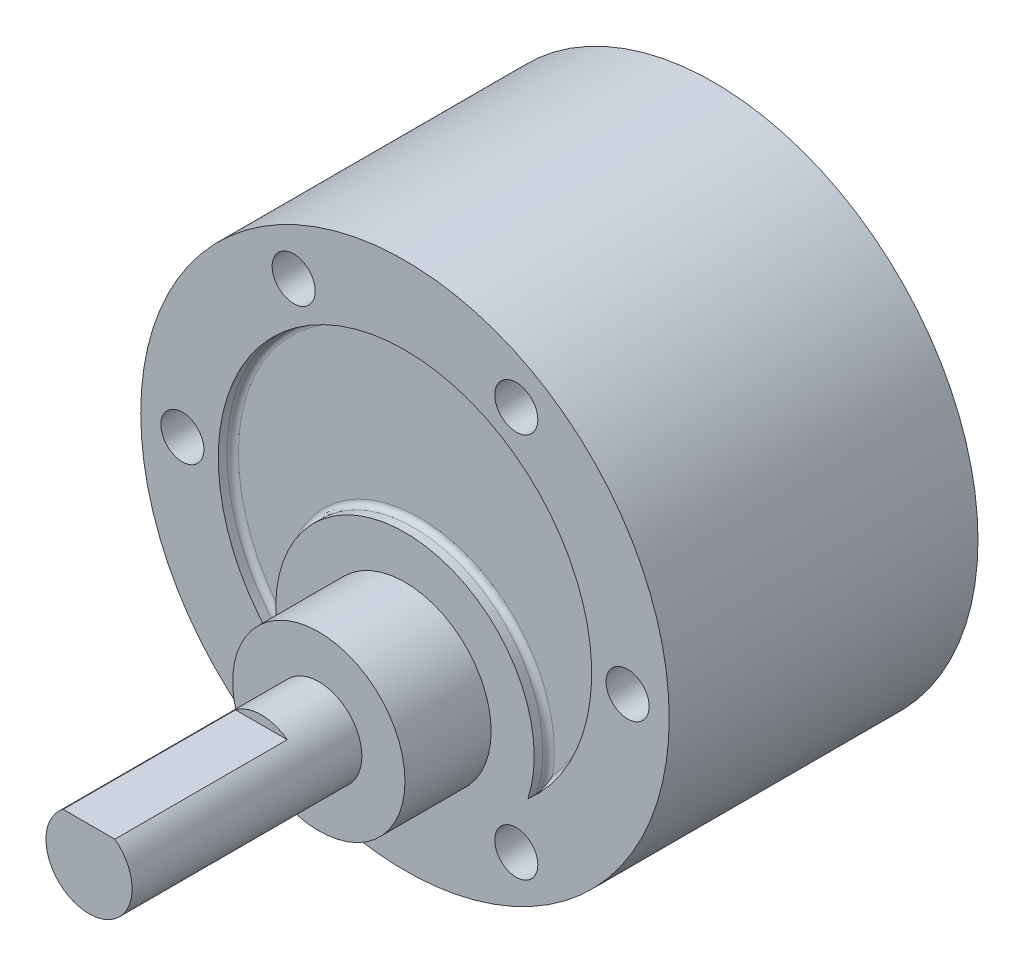
ISO-10303-21;
HEADER;
FILE_DESCRIPTION(('STEP AP214'),'2;1');
FILE_NAME('part.step','',(''),(''),'','','');
FILE_SCHEMA(('AUTOMOTIVE_DESIGN { 1 0 10303 214 1 1 1 1 }'));
ENDSEC;
DATA;
#1=APPLICATION_CONTEXT('core data for automotive mechanical design processes');
#2=APPLICATION_PROTOCOL_DEFINITION('international standard','automotive_design',2000,#1);
#3=PRODUCT_CONTEXT('',#1,'mechanical');
#4=PRODUCT('Part','Part','',(#3));
#5=PRODUCT_RELATED_PRODUCT_CATEGORY('part','',(#4));
#6=PRODUCT_DEFINITION_FORMATION('','',#4);
#7=PRODUCT_DEFINITION_CONTEXT('part definition',#1,'design');
#8=PRODUCT_DEFINITION('design','',#6,#7);
#9=PRODUCT_DEFINITION_SHAPE('','',#8);
#10=(LENGTH_UNIT() NAMED_UNIT(*) SI_UNIT(.MILLI.,.METRE.));
#11=(NAMED_UNIT(*) PLANE_ANGLE_UNIT() SI_UNIT($,.RADIAN.));
#12=(NAMED_UNIT(*) SI_UNIT($,.STERADIAN.) SOLID_ANGLE_UNIT());
#13=UNCERTAINTY_MEASURE_WITH_UNIT(LENGTH_MEASURE(1.E-05),#10,'distance_accuracy_value','');
#14=(GEOMETRIC_REPRESENTATION_CONTEXT(3) GLOBAL_UNCERTAINTY_ASSIGNED_CONTEXT((#13)) GLOBAL_UNIT_ASSIGNED_CONTEXT((#10,
#11,#12)) REPRESENTATION_CONTEXT('',''));
#15=CARTESIAN_POINT('',(0.,0.,0.));
#16=DIRECTION('',(0.,0.,1.));
#17=DIRECTION('',(1.,0.,0.));
#18=AXIS2_PLACEMENT_3D('',#15,#16,#17);
#19=CARTESIAN_POINT('',(0.,-7.,27.5));
#20=DIRECTION('',(0.,0.,1.));
#21=DIRECTION('',(1.,0.,0.));
#22=AXIS2_PLACEMENT_3D('',#19,#20,#21);
#23=PLANE('',#22);
#24=CARTESIAN_POINT('',(0.,-7.,27.5));
#25=DIRECTION('',(0.,0.,1.));
#26=DIRECTION('',(1.,0.,0.));
#27=AXIS2_PLACEMENT_3D('',#24,#25,#26);
#28=CIRCLE('',#27,6.);
#29=CARTESIAN_POINT('',(6.,-7.,27.5));
#30=VERTEX_POINT('',#29);
#31=EDGE_CURVE('E129',#30,#30,#28,.T.);
#32=ORIENTED_EDGE('',*,*,#31,.T.);
#33=EDGE_LOOP('',(#32));
#34=FACE_BOUND('',#33,.T.);
#35=CARTESIAN_POINT('',(0.,-7.,27.5));
#36=DIRECTION('',(0.,0.,1.));
#37=DIRECTION('',(1.,0.,0.));
#38=AXIS2_PLACEMENT_3D('',#35,#36,#37);
#39=CIRCLE('',#38,3.);
#40=CARTESIAN_POINT('',(3.,-7.,27.5));
#41=VERTEX_POINT('',#40);
#42=EDGE_CURVE('E114',#41,#41,#39,.T.);
#43=ORIENTED_EDGE('',*,*,#42,.F.);
#44=EDGE_LOOP('',(#43));
#45=FACE_BOUND('',#44,.T.);
#46=ADVANCED_FACE('F36',(#34,#45),#23,.T.);
#47=CARTESIAN_POINT('',(0.,0.,21.5));
#48=DIRECTION('',(0.,0.,-1.));
#49=DIRECTION('',(-1.,0.,0.));
#50=AXIS2_PLACEMENT_3D('',#47,#48,#49);
#51=CYLINDRICAL_SURFACE('',#50,18.4);
#52=CARTESIAN_POINT('',(0.,0.,21.5));
#53=DIRECTION('',(0.,0.,1.));
#54=DIRECTION('',(1.,0.,0.));
#55=AXIS2_PLACEMENT_3D('',#52,#53,#54);
#56=CIRCLE('',#55,18.4);
#57=CARTESIAN_POINT('',(18.4,0.,21.5));
#58=VERTEX_POINT('',#57);
#59=EDGE_CURVE('E135',#58,#58,#56,.T.);
#60=ORIENTED_EDGE('',*,*,#59,.F.);
#61=EDGE_LOOP('',(#60));
#62=FACE_BOUND('',#61,.T.);
#63=CARTESIAN_POINT('',(0.,0.,0.));
#64=DIRECTION('',(0.,0.,1.));
#65=DIRECTION('',(1.,0.,0.));
#66=AXIS2_PLACEMENT_3D('',#63,#64,#65);
#67=CIRCLE('',#66,18.4);
#68=CARTESIAN_POINT('',(18.4,0.,0.));
#69=VERTEX_POINT('',#68);
#70=EDGE_CURVE('E132',#69,#69,#67,.T.);
#71=ORIENTED_EDGE('',*,*,#70,.T.);
#72=EDGE_LOOP('',(#71));
#73=FACE_BOUND('',#72,.T.);
#74=ADVANCED_FACE('F156',(#62,#73),#51,.T.);
#75=CARTESIAN_POINT('',(0.,0.,21.5));
#76=DIRECTION('',(0.,0.,1.));
#77=DIRECTION('',(1.,0.,0.));
#78=AXIS2_PLACEMENT_3D('',#75,#76,#77);
#79=PLANE('',#78);
#80=CARTESIAN_POINT('',(-15.4999946,0.,21.5));
#81=DIRECTION('',(0.,0.,1.));
#82=DIRECTION('',(1.,0.,0.));
#83=AXIS2_PLACEMENT_3D('',#80,#81,#82);
#84=CIRCLE('',#83,1.5);
#85=CARTESIAN_POINT('',(-13.9999946,0.,21.5));
#86=VERTEX_POINT('',#85);
#87=EDGE_CURVE('E249',#86,#86,#84,.T.);
#88=ORIENTED_EDGE('',*,*,#87,.F.);
#89=EDGE_LOOP('',(#88));
#90=FACE_BOUND('',#89,.T.);
#91=CARTESIAN_POINT('',(-7.74999730000016,-13.4233890821215,21.5));
#92=DIRECTION('',(0.,0.,1.));
#93=DIRECTION('',(1.,0.,0.));
#94=AXIS2_PLACEMENT_3D('',#91,#92,#93);
#95=CIRCLE('',#94,1.5);
#96=CARTESIAN_POINT('',(-6.24999730000016,-13.4233890821215,21.5));
#97=VERTEX_POINT('',#96);
#98=EDGE_CURVE('E258',#97,#97,#95,.T.);
#99=ORIENTED_EDGE('',*,*,#98,.F.);
#100=EDGE_LOOP('',(#99));
#101=FACE_BOUND('',#100,.T.);
#102=CARTESIAN_POINT('',(7.7499973000002,-13.4233890821213,21.5));
#103=DIRECTION('',(0.,0.,1.));
#104=DIRECTION('',(1.,0.,0.));
#105=AXIS2_PLACEMENT_3D('',#102,#103,#104);
#106=CIRCLE('',#105,1.49999999999997);
#107=CARTESIAN_POINT('',(9.24999730000016,-13.4233890821213,21.5));
#108=VERTEX_POINT('',#107);
#109=EDGE_CURVE('E107',#108,#108,#106,.T.);
#110=ORIENTED_EDGE('',*,*,#109,.F.);
#111=EDGE_LOOP('',(#110));
#112=FACE_BOUND('',#111,.T.);
#113=CARTESIAN_POINT('',(15.4999946,4.38993287727106E-13,21.5));
#114=DIRECTION('',(0.,0.,1.));
#115=DIRECTION('',(1.,0.,0.));
#116=AXIS2_PLACEMENT_3D('',#113,#114,#115);
#117=CIRCLE('',#116,1.50000000000016);
#118=CARTESIAN_POINT('',(16.9999946000002,4.38993287727106E-13,21.5));
#119=VERTEX_POINT('',#118);
#120=EDGE_CURVE('E275',#119,#119,#117,.T.);
#121=ORIENTED_EDGE('',*,*,#120,.F.);
#122=EDGE_LOOP('',(#121));
#123=FACE_BOUND('',#122,.T.);
#124=CARTESIAN_POINT('',(7.74999729999981,13.4233890821219,21.5));
#125=DIRECTION('',(0.,0.,1.));
#126=DIRECTION('',(1.,0.,0.));
#127=AXIS2_PLACEMENT_3D('',#124,#125,#126);
#128=CIRCLE('',#127,1.5000000000003);
#129=CARTESIAN_POINT('',(9.24999730000011,13.4233890821219,21.5));
#130=VERTEX_POINT('',#129);
#131=EDGE_CURVE('E269',#130,#130,#128,.T.);
#132=ORIENTED_EDGE('',*,*,#131,.F.);
#133=EDGE_LOOP('',(#132));
#134=FACE_BOUND('',#133,.T.);
#135=CARTESIAN_POINT('',(-7.74999729999997,13.4233890821216,21.5));
#136=DIRECTION('',(0.,0.,1.));
#137=DIRECTION('',(1.,0.,0.));
#138=AXIS2_PLACEMENT_3D('',#135,#136,#137);
#139=CIRCLE('',#138,1.5);
#140=CARTESIAN_POINT('',(-6.24999729999997,13.4233890821216,21.5));
#141=VERTEX_POINT('',#140);
#142=EDGE_CURVE('E263',#141,#141,#139,.T.);
#143=ORIENTED_EDGE('',*,*,#142,.F.);
#144=EDGE_LOOP('',(#143));
#145=FACE_BOUND('',#144,.T.);
#146=CARTESIAN_POINT('',(0.,-7.,21.5));
#147=DIRECTION('',(0.,0.,-1.));
#148=DIRECTION('',(1.,0.,0.));
#149=AXIS2_PLACEMENT_3D('',#146,#147,#148);
#150=CIRCLE('',#149,9.);
#151=CARTESIAN_POINT('',(-8.55802523473537,-9.78571428571429,21.5));
#152=VERTEX_POINT('',#151);
#153=CARTESIAN_POINT('',(8.55802523473537,-9.78571428571429,21.5));
#154=VERTEX_POINT('',#153);
#155=EDGE_CURVE('E91',#152,#154,#150,.T.);
#156=ORIENTED_EDGE('',*,*,#155,.F.);
#157=CARTESIAN_POINT('',(0.,0.,21.5));
#158=DIRECTION('',(0.,0.,1.));
#159=DIRECTION('',(1.,0.,0.));
#160=AXIS2_PLACEMENT_3D('',#157,#158,#159);
#161=CIRCLE('',#160,13.);
#162=EDGE_CURVE('E98',#154,#152,#161,.T.);
#163=ORIENTED_EDGE('',*,*,#162,.F.);
#164=EDGE_LOOP('',(#156,#163));
#165=FACE_BOUND('',#164,.T.);
#166=CARTESIAN_POINT('',(0.,-7.,21.5));
#167=DIRECTION('',(0.,0.,1.));
#168=DIRECTION('',(1.,0.,0.));
#169=AXIS2_PLACEMENT_3D('',#166,#167,#168);
#170=CIRCLE('',#169,6.);
#171=CARTESIAN_POINT('',(6.,-7.,21.5));
#172=VERTEX_POINT('',#171);
#173=EDGE_CURVE('E128',#172,#172,#170,.T.);
#174=ORIENTED_EDGE('',*,*,#173,.F.);
#175=EDGE_LOOP('',(#174));
#176=FACE_BOUND('',#175,.T.);
#177=ORIENTED_EDGE('',*,*,#59,.T.);
#178=EDGE_LOOP('',(#177));
#179=FACE_BOUND('',#178,.T.);
#180=ADVANCED_FACE('F102',(#90,#101,#112,#123,#134,#145,#165,#176,#179),#79,.T.);
#181=CARTESIAN_POINT('',(0.,0.,0.));
#182=DIRECTION('',(0.,0.,1.));
#183=DIRECTION('',(1.,0.,0.));
#184=AXIS2_PLACEMENT_3D('',#181,#182,#183);
#185=PLANE('',#184);
#186=ORIENTED_EDGE('',*,*,#70,.F.);
#187=EDGE_LOOP('',(#186));
#188=FACE_BOUND('',#187,.T.);
#189=ADVANCED_FACE('F161',(#188),#185,.F.);
#190=CARTESIAN_POINT('',(0.,-7.,27.5));
#191=DIRECTION('',(0.,0.,-1.));
#192=DIRECTION('',(-1.,0.,0.));
#193=AXIS2_PLACEMENT_3D('',#190,#191,#192);
#194=CYLINDRICAL_SURFACE('',#193,6.);
#195=ORIENTED_EDGE('',*,*,#31,.F.);
#196=EDGE_LOOP('',(#195));
#197=FACE_BOUND('',#196,.T.);
#198=ORIENTED_EDGE('',*,*,#173,.T.);
#199=EDGE_LOOP('',(#198));
#200=FACE_BOUND('',#199,.T.);
#201=ADVANCED_FACE('F164',(#197,#200),#194,.T.);
#202=CARTESIAN_POINT('',(0.,-7.,43.5));
#203=DIRECTION('',(0.,0.,-1.));
#204=DIRECTION('',(-1.,0.,0.));
#205=AXIS2_PLACEMENT_3D('',#202,#203,#204);
#206=CYLINDRICAL_SURFACE('',#205,3.);
#207=ORIENTED_EDGE('',*,*,#42,.T.);
#208=EDGE_LOOP('',(#207));
#209=FACE_BOUND('',#208,.T.);
#210=DIRECTION('',(0.,0.,-1.));
#211=VECTOR('',#210,1.);
#212=CARTESIAN_POINT('',(-1.8,-4.6,43.5));
#213=LINE('',#212,#211);
#214=CARTESIAN_POINT('',(-1.8,-4.6,43.5));
#215=VERTEX_POINT('',#214);
#216=CARTESIAN_POINT('',(-1.8,-4.6,31.5));
#217=VERTEX_POINT('',#216);
#218=EDGE_CURVE('E120',#215,#217,#213,.T.);
#219=ORIENTED_EDGE('',*,*,#218,.T.);
#220=CARTESIAN_POINT('',(0.,-7.,31.5));
#221=DIRECTION('',(0.,0.,1.));
#222=DIRECTION('',(1.,0.,0.));
#223=AXIS2_PLACEMENT_3D('',#220,#221,#222);
#224=CIRCLE('',#223,3.);
#225=CARTESIAN_POINT('',(1.8,-4.6,31.5));
#226=VERTEX_POINT('',#225);
#227=EDGE_CURVE('E95',#226,#217,#224,.T.);
#228=ORIENTED_EDGE('',*,*,#227,.F.);
#229=DIRECTION('',(0.,0.,-1.));
#230=VECTOR('',#229,1.);
#231=CARTESIAN_POINT('',(1.8,-4.6,43.5));
#232=LINE('',#231,#230);
#233=CARTESIAN_POINT('',(1.8,-4.6,43.5));
#234=VERTEX_POINT('',#233);
#235=EDGE_CURVE('E125',#234,#226,#232,.T.);
#236=ORIENTED_EDGE('',*,*,#235,.F.);
#237=CARTESIAN_POINT('',(0.,-7.,43.5));
#238=DIRECTION('',(0.,0.,1.));
#239=DIRECTION('',(1.,0.,0.));
#240=AXIS2_PLACEMENT_3D('',#237,#238,#239);
#241=CIRCLE('',#240,3.);
#242=EDGE_CURVE('E115',#215,#234,#241,.T.);
#243=ORIENTED_EDGE('',*,*,#242,.F.);
#244=EDGE_LOOP('',(#219,#228,#236,#243));
#245=FACE_BOUND('',#244,.T.);
#246=ADVANCED_FACE('F171',(#209,#245),#206,.T.);
#247=CARTESIAN_POINT('',(1.8,-4.6,43.5));
#248=DIRECTION('',(0.,-1.,0.));
#249=DIRECTION('',(0.,0.,-1.));
#250=AXIS2_PLACEMENT_3D('',#247,#248,#249);
#251=PLANE('',#250);
#252=ORIENTED_EDGE('',*,*,#235,.T.);
#253=DIRECTION('',(1.,0.,0.));
#254=VECTOR('',#253,1.);
#255=CARTESIAN_POINT('',(-1.8,-4.6,31.5));
#256=LINE('',#255,#254);
#257=EDGE_CURVE('E112',#217,#226,#256,.T.);
#258=ORIENTED_EDGE('',*,*,#257,.F.);
#259=ORIENTED_EDGE('',*,*,#218,.F.);
#260=DIRECTION('',(-1.,0.,0.));
#261=VECTOR('',#260,1.);
#262=CARTESIAN_POINT('',(1.8,-4.6,43.5));
#263=LINE('',#262,#261);
#264=EDGE_CURVE('E118',#234,#215,#263,.T.);
#265=ORIENTED_EDGE('',*,*,#264,.F.);
#266=EDGE_LOOP('',(#252,#258,#259,#265));
#267=FACE_BOUND('',#266,.T.);
#268=ADVANCED_FACE('F178',(#267),#251,.F.);
#269=CARTESIAN_POINT('',(0.,-7.,43.5));
#270=DIRECTION('',(0.,0.,1.));
#271=DIRECTION('',(1.,0.,0.));
#272=AXIS2_PLACEMENT_3D('',#269,#270,#271);
#273=PLANE('',#272);
#274=ORIENTED_EDGE('',*,*,#242,.T.);
#275=ORIENTED_EDGE('',*,*,#264,.T.);
#276=EDGE_LOOP('',(#274,#275));
#277=FACE_BOUND('',#276,.T.);
#278=ADVANCED_FACE('F182',(#277),#273,.T.);
#279=CARTESIAN_POINT('',(0.,-7.,31.5));
#280=DIRECTION('',(0.,0.,1.));
#281=DIRECTION('',(1.,0.,0.));
#282=AXIS2_PLACEMENT_3D('',#279,#280,#281);
#283=PLANE('',#282);
#284=ORIENTED_EDGE('',*,*,#227,.T.);
#285=ORIENTED_EDGE('',*,*,#257,.T.);
#286=EDGE_LOOP('',(#284,#285));
#287=FACE_BOUND('',#286,.T.);
#288=ADVANCED_FACE('F186',(#287),#283,.T.);
#289=CARTESIAN_POINT('',(0.,-7.,20.5));
#290=DIRECTION('',(0.,0.,1.));
#291=DIRECTION('',(1.,0.,0.));
#292=AXIS2_PLACEMENT_3D('',#289,#290,#291);
#293=CYLINDRICAL_SURFACE('',#292,9.);
#294=DIRECTION('',(0.,0.,1.));
#295=VECTOR('',#294,1.);
#296=CARTESIAN_POINT('',(8.55802523473537,-9.78571428571429,20.5));
#297=LINE('',#296,#295);
#298=CARTESIAN_POINT('',(8.55802523473537,-9.78571428571429,20.9));
#299=VERTEX_POINT('',#298);
#300=EDGE_CURVE('E96',#299,#154,#297,.T.);
#301=ORIENTED_EDGE('',*,*,#300,.F.);
#302=CARTESIAN_POINT('',(0.,-7.,20.9));
#303=DIRECTION('',(0.,0.,1.));
#304=DIRECTION('',(1.,0.,0.));
#305=AXIS2_PLACEMENT_3D('',#302,#303,#304);
#306=CIRCLE('',#305,9.);
#307=CARTESIAN_POINT('',(-8.55802523473537,-9.78571428571429,20.9));
#308=VERTEX_POINT('',#307);
#309=EDGE_CURVE('E11',#299,#308,#306,.T.);
#310=ORIENTED_EDGE('',*,*,#309,.T.);
#311=DIRECTION('',(0.,0.,1.));
#312=VECTOR('',#311,1.);
#313=CARTESIAN_POINT('',(-8.55802523473537,-9.78571428571429,20.5));
#314=LINE('',#313,#312);
#315=EDGE_CURVE('E87',#308,#152,#314,.T.);
#316=ORIENTED_EDGE('',*,*,#315,.T.);
#317=ORIENTED_EDGE('',*,*,#155,.T.);
#318=EDGE_LOOP('',(#301,#310,#316,#317));
#319=FACE_BOUND('',#318,.T.);
#320=ADVANCED_FACE('F89',(#319),#293,.T.);
#321=CARTESIAN_POINT('',(0.,0.,20.5));
#322=DIRECTION('',(0.,0.,1.));
#323=DIRECTION('',(1.,0.,0.));
#324=AXIS2_PLACEMENT_3D('',#321,#322,#323);
#325=CYLINDRICAL_SURFACE('',#324,13.);
#326=ORIENTED_EDGE('',*,*,#315,.F.);
#327=CARTESIAN_POINT('',(0.,0.,20.9));
#328=DIRECTION('',(0.,0.,1.));
#329=DIRECTION('',(1.,0.,0.));
#330=AXIS2_PLACEMENT_3D('',#327,#328,#329);
#331=CIRCLE('',#330,13.);
#332=EDGE_CURVE('E50',#308,#299,#331,.F.);
#333=ORIENTED_EDGE('',*,*,#332,.T.);
#334=ORIENTED_EDGE('',*,*,#300,.T.);
#335=ORIENTED_EDGE('',*,*,#162,.T.);
#336=EDGE_LOOP('',(#326,#333,#334,#335));
#337=FACE_BOUND('',#336,.T.);
#338=ADVANCED_FACE('F99',(#337),#325,.F.);
#339=CARTESIAN_POINT('',(0.,-3.5,20.5));
#340=DIRECTION('',(0.,0.,1.));
#341=DIRECTION('',(1.,0.,0.));
#342=AXIS2_PLACEMENT_3D('',#339,#340,#341);
#343=PLANE('',#342);
#344=CARTESIAN_POINT('',(0.,-7.,20.5));
#345=DIRECTION('',(0.,0.,1.));
#346=DIRECTION('',(1.,0.,0.));
#347=AXIS2_PLACEMENT_3D('',#344,#345,#346);
#348=CIRCLE('',#347,9.4);
#349=CARTESIAN_POINT('',(-9.27488379376017,-8.52857142857141,20.5));
#350=VERTEX_POINT('',#349);
#351=CARTESIAN_POINT('',(9.27488379376017,-8.52857142857141,20.5));
#352=VERTEX_POINT('',#351);
#353=EDGE_CURVE('E138',#350,#352,#348,.F.);
#354=ORIENTED_EDGE('',*,*,#353,.T.);
#355=CARTESIAN_POINT('',(0.,0.,20.5));
#356=DIRECTION('',(0.,0.,1.));
#357=DIRECTION('',(1.,0.,0.));
#358=AXIS2_PLACEMENT_3D('',#355,#356,#357);
#359=CIRCLE('',#358,12.6);
#360=EDGE_CURVE('E142',#352,#350,#359,.T.);
#361=ORIENTED_EDGE('',*,*,#360,.T.);
#362=EDGE_LOOP('',(#354,#361));
#363=FACE_BOUND('',#362,.T.);
#364=ADVANCED_FACE('F154',(#363),#343,.T.);
#365=CARTESIAN_POINT('',(0.,-7.,20.9));
#366=DIRECTION('',(0.,0.,1.));
#367=DIRECTION('',(1.,0.,0.));
#368=AXIS2_PLACEMENT_3D('',#365,#366,#367);
#369=TOROIDAL_SURFACE('',#368,9.4,0.4);
#370=CARTESIAN_POINT('',(-8.55802523473537,-9.78571428571429,20.9));
#371=CARTESIAN_POINT('',(-8.55801038517168,-9.78573638118408,20.8926974552355));
#372=CARTESIAN_POINT('',(-8.55843941683146,-9.78508688580115,20.8854358412093));
#373=CARTESIAN_POINT('',(-8.56003893272963,-9.78266296523044,20.8713033605038));
#374=CARTESIAN_POINT('',(-8.56119731939547,-9.78090689407262,20.8644280749302));
#375=CARTESIAN_POINT('',(-8.56447392890516,-9.77593490569276,20.8495052934104));
#376=CARTESIAN_POINT('',(-8.56675744139402,-9.77246725094203,20.8415814115048));
#377=CARTESIAN_POINT('',(-8.57198401147741,-9.76451748685285,20.8264529242715));
#378=CARTESIAN_POINT('',(-8.57493142405275,-9.76002867702296,20.8192535444165));
#379=CARTESIAN_POINT('',(-8.58378526244609,-9.74651899269187,20.8000907221473));
#380=CARTESIAN_POINT('',(-8.59017842182282,-9.73673645541604,20.7889010279473));
#381=CARTESIAN_POINT('',(-8.60367422192209,-9.71600388252824,20.7682061061604));
#382=CARTESIAN_POINT('',(-8.61077822924724,-9.70505159524466,20.7587042245769));
#383=CARTESIAN_POINT('',(-8.62954514648425,-9.67599718347727,20.7358744545591));
#384=CARTESIAN_POINT('',(-8.64149845512846,-9.6573781761928,20.723453069336));
#385=CARTESIAN_POINT('',(-8.66584426773862,-9.61919045410263,20.7006367184297));
#386=CARTESIAN_POINT('',(-8.67823774051909,-9.59961960418961,20.690246598226));
#387=CARTESIAN_POINT('',(-8.70329502541288,-9.55976655884949,20.6709155242382));
#388=CARTESIAN_POINT('',(-8.71595997529503,-9.53948094650649,20.6619831621894));
#389=CARTESIAN_POINT('',(-8.74135309962428,-9.49850821025259,20.6453093792944));
#390=CARTESIAN_POINT('',(-8.75408118845214,-9.47782155620908,20.6375666496188));
#391=CARTESIAN_POINT('',(-8.78896431181609,-9.4207012747644,20.6176553807703));
#392=CARTESIAN_POINT('',(-8.81112851694779,-9.38393794983729,20.6064493201507));
#393=CARTESIAN_POINT('',(-8.85528660924878,-9.30971136021256,20.5862084075319));
#394=CARTESIAN_POINT('',(-8.87728040610695,-9.27224775607638,20.5771746395278));
#395=CARTESIAN_POINT('',(-8.94292063695479,-9.15890767767414,20.5526854751684));
#396=CARTESIAN_POINT('',(-8.98614747075172,-9.08221019439125,20.5398830891268));
#397=CARTESIAN_POINT('',(-9.07094477901729,-8.92746653351209,20.5197499900415));
#398=CARTESIAN_POINT('',(-9.11251862593807,-8.84942362281507,20.5124075312001));
#399=CARTESIAN_POINT('',(-9.19388287380135,-8.69220938204517,20.5025854992802));
#400=CARTESIAN_POINT('',(-9.23367523348215,-8.61303942405976,20.5001004504695));
#401=CARTESIAN_POINT('',(-9.27330568122929,-8.53180904624886,20.5000010028125));
#402=CARTESIAN_POINT('',(-9.27409493450113,-8.53019032803597,20.5000000081349));
#403=CARTESIAN_POINT('',(-9.27488379376017,-8.52857142857144,20.5));
#404=B_SPLINE_CURVE_WITH_KNOTS('',3,(#370,#371,#372,#373,#374,#375,#376,#377,#378,#379,#380,
#381,#382,#383,#384,#385,#386,#387,#388,#389,#390,#391,#392,#393,#394,#395,#396,#397,#398,#399,
#400,#401,#402,#403),.UNSPECIFIED.,.F.,.F.,(4,2,2,2,2,2,2,2,2,2,2,2,2,2,2,2,4),(0.,
0.0218008606853614,0.0432493138475454,0.0699341984971374,0.0967995072183573,0.14506683750978,
0.193428812610986,0.269358257896319,0.345466676252328,0.422008616986925,0.49846573405021,
0.631475658441905,0.764551818967796,1.03116989885313,1.29721273763758,1.56295549440646,
1.56835813417429),.UNSPECIFIED.);
#405=EDGE_CURVE('E105',#308,#350,#404,.T.);
#406=ORIENTED_EDGE('',*,*,#405,.F.);
#407=ORIENTED_EDGE('',*,*,#309,.F.);
#408=CARTESIAN_POINT('',(8.55802523473537,-9.78571428571429,20.9));
#409=CARTESIAN_POINT('',(8.55801038517168,-9.78573638118408,20.8926974552355));
#410=CARTESIAN_POINT('',(8.55843941683146,-9.78508688580115,20.8854358412093));
#411=CARTESIAN_POINT('',(8.56003893272963,-9.78266296523044,20.8713033605039));
#412=CARTESIAN_POINT('',(8.56119731939547,-9.78090689407262,20.8644280749302));
#413=CARTESIAN_POINT('',(8.56447392890516,-9.77593490569277,20.8495052934104));
#414=CARTESIAN_POINT('',(8.56675744139402,-9.77246725094204,20.8415814115048));
#415=CARTESIAN_POINT('',(8.57198401147741,-9.76451748685285,20.8264529242715));
#416=CARTESIAN_POINT('',(8.57493142405275,-9.76002867702295,20.8192535444165));
#417=CARTESIAN_POINT('',(8.58378526244609,-9.74651899269186,20.8000907221473));
#418=CARTESIAN_POINT('',(8.59017842182282,-9.73673645541604,20.7889010279473));
#419=CARTESIAN_POINT('',(8.60367422192209,-9.71600388252824,20.7682061061604));
#420=CARTESIAN_POINT('',(8.61077822924724,-9.70505159524466,20.7587042245769));
#421=CARTESIAN_POINT('',(8.62954514648426,-9.67599718347727,20.7358744545591));
#422=CARTESIAN_POINT('',(8.64149845512847,-9.6573781761928,20.723453069336));
#423=CARTESIAN_POINT('',(8.66584426773862,-9.61919045410262,20.7006367184297));
#424=CARTESIAN_POINT('',(8.6782377405191,-9.5996196041896,20.690246598226));
#425=CARTESIAN_POINT('',(8.70329502541289,-9.55976655884948,20.6709155242382));
#426=CARTESIAN_POINT('',(8.71595997529504,-9.53948094650648,20.6619831621893));
#427=CARTESIAN_POINT('',(8.74135309962429,-9.49850821025257,20.6453093792944));
#428=CARTESIAN_POINT('',(8.75408118845215,-9.47782155620907,20.6375666496188));
#429=CARTESIAN_POINT('',(8.7889643118161,-9.42070127476438,20.6176553807703));
#430=CARTESIAN_POINT('',(8.81112851694781,-9.38393794983728,20.6064493201507));
#431=CARTESIAN_POINT('',(8.85528660924879,-9.30971136021254,20.5862084075319));
#432=CARTESIAN_POINT('',(8.87728040610696,-9.27224775607637,20.5771746395278));
#433=CARTESIAN_POINT('',(8.9429206369548,-9.15890767767413,20.5526854751684));
#434=CARTESIAN_POINT('',(8.98614747075173,-9.08221019439123,20.5398830891268));
#435=CARTESIAN_POINT('',(9.07094477901729,-8.92746653351207,20.5197499900415));
#436=CARTESIAN_POINT('',(9.11251862593807,-8.84942362281505,20.5124075312001));
#437=CARTESIAN_POINT('',(9.19388287380136,-8.69220938204517,20.5025854992802));
#438=CARTESIAN_POINT('',(9.23367523348218,-8.61303942405977,20.5001004504695));
#439=CARTESIAN_POINT('',(9.2733056812293,-8.53180904624886,20.5000010028125));
#440=CARTESIAN_POINT('',(9.27409493450113,-8.53019032803597,20.5000000081349));
#441=CARTESIAN_POINT('',(9.27488379376017,-8.52857142857144,20.5));
#442=B_SPLINE_CURVE_WITH_KNOTS('',3,(#408,#409,#410,#411,#412,#413,#414,#415,#416,#417,#418,
#419,#420,#421,#422,#423,#424,#425,#426,#427,#428,#429,#430,#431,#432,#433,#434,#435,#436,#437,
#438,#439,#440,#441),.UNSPECIFIED.,.F.,.F.,(4,2,2,2,2,2,2,2,2,2,2,2,2,2,2,2,4),(0.,
0.0218008606853584,0.0432493138475445,0.0699341984971383,0.0967995072183628,0.14506683750978,
0.193428812610994,0.269358257896327,0.345466676252341,0.422008616986945,0.498465734050234,
0.631475658441927,0.764551818967817,1.03116989885315,1.2972127376376,1.56295549440646,
1.56835813417429),.UNSPECIFIED.);
#443=EDGE_CURVE('E41',#352,#299,#442,.F.);
#444=ORIENTED_EDGE('',*,*,#443,.F.);
#445=ORIENTED_EDGE('',*,*,#353,.F.);
#446=EDGE_LOOP('',(#406,#407,#444,#445));
#447=FACE_BOUND('',#446,.T.);
#448=ADVANCED_FACE('F150',(#447),#369,.F.);
#449=CARTESIAN_POINT('',(0.,0.,20.9));
#450=DIRECTION('',(0.,0.,1.));
#451=DIRECTION('',(1.,0.,0.));
#452=AXIS2_PLACEMENT_3D('',#449,#450,#451);
#453=TOROIDAL_SURFACE('',#452,12.6,0.4);
#454=ORIENTED_EDGE('',*,*,#443,.T.);
#455=ORIENTED_EDGE('',*,*,#332,.F.);
#456=ORIENTED_EDGE('',*,*,#405,.T.);
#457=ORIENTED_EDGE('',*,*,#360,.F.);
#458=EDGE_LOOP('',(#454,#455,#456,#457));
#459=FACE_BOUND('',#458,.T.);
#460=ADVANCED_FACE('F38',(#459),#453,.F.);
#461=CARTESIAN_POINT('',(-7.74999729999997,13.4233890821216,18.5));
#462=DIRECTION('',(0.,0.,1.));
#463=DIRECTION('',(1.,0.,0.));
#464=AXIS2_PLACEMENT_3D('',#461,#462,#463);
#465=CYLINDRICAL_SURFACE('',#464,1.5);
#466=CARTESIAN_POINT('',(-7.74999729999997,13.4233890821216,18.5));
#467=DIRECTION('',(0.,0.,1.));
#468=DIRECTION('',(1.,0.,0.));
#469=AXIS2_PLACEMENT_3D('',#466,#467,#468);
#470=CIRCLE('',#469,1.5);
#471=CARTESIAN_POINT('',(-6.24999729999997,13.4233890821216,18.5));
#472=VERTEX_POINT('',#471);
#473=EDGE_CURVE('E252',#472,#472,#470,.T.);
#474=ORIENTED_EDGE('',*,*,#473,.F.);
#475=EDGE_LOOP('',(#474));
#476=FACE_BOUND('',#475,.T.);
#477=ORIENTED_EDGE('',*,*,#142,.T.);
#478=EDGE_LOOP('',(#477));
#479=FACE_BOUND('',#478,.T.);
#480=ADVANCED_FACE('F224',(#476,#479),#465,.F.);
#481=CARTESIAN_POINT('',(-7.74999729999997,13.4233890821216,18.5));
#482=DIRECTION('',(0.,0.,1.));
#483=DIRECTION('',(1.,0.,0.));
#484=AXIS2_PLACEMENT_3D('',#481,#482,#483);
#485=PLANE('',#484);
#486=ORIENTED_EDGE('',*,*,#473,.T.);
#487=EDGE_LOOP('',(#486));
#488=FACE_BOUND('',#487,.T.);
#489=ADVANCED_FACE('F219',(#488),#485,.T.);
#490=CARTESIAN_POINT('',(7.74999729999981,13.4233890821219,18.5));
#491=DIRECTION('',(0.,0.,1.));
#492=DIRECTION('',(1.,0.,0.));
#493=AXIS2_PLACEMENT_3D('',#490,#491,#492);
#494=CYLINDRICAL_SURFACE('',#493,1.5000000000003);
#495=CARTESIAN_POINT('',(7.74999729999981,13.4233890821219,18.5));
#496=DIRECTION('',(0.,0.,1.));
#497=DIRECTION('',(1.,0.,0.));
#498=AXIS2_PLACEMENT_3D('',#495,#496,#497);
#499=CIRCLE('',#498,1.5000000000003);
#500=CARTESIAN_POINT('',(9.24999730000011,13.4233890821219,18.5));
#501=VERTEX_POINT('',#500);
#502=EDGE_CURVE('E266',#501,#501,#499,.T.);
#503=ORIENTED_EDGE('',*,*,#502,.F.);
#504=EDGE_LOOP('',(#503));
#505=FACE_BOUND('',#504,.T.);
#506=ORIENTED_EDGE('',*,*,#131,.T.);
#507=EDGE_LOOP('',(#506));
#508=FACE_BOUND('',#507,.T.);
#509=ADVANCED_FACE('F216',(#505,#508),#494,.F.);
#510=CARTESIAN_POINT('',(7.74999729999981,13.4233890821219,18.5));
#511=DIRECTION('',(0.,0.,1.));
#512=DIRECTION('',(1.,0.,0.));
#513=AXIS2_PLACEMENT_3D('',#510,#511,#512);
#514=PLANE('',#513);
#515=ORIENTED_EDGE('',*,*,#502,.T.);
#516=EDGE_LOOP('',(#515));
#517=FACE_BOUND('',#516,.T.);
#518=ADVANCED_FACE('F211',(#517),#514,.T.);
#519=CARTESIAN_POINT('',(15.4999946,4.38993287727106E-13,18.5));
#520=DIRECTION('',(0.,0.,1.));
#521=DIRECTION('',(1.,0.,0.));
#522=AXIS2_PLACEMENT_3D('',#519,#520,#521);
#523=CYLINDRICAL_SURFACE('',#522,1.50000000000016);
#524=CARTESIAN_POINT('',(15.4999946,4.38993287727106E-13,18.5));
#525=DIRECTION('',(0.,0.,1.));
#526=DIRECTION('',(1.,0.,0.));
#527=AXIS2_PLACEMENT_3D('',#524,#525,#526);
#528=CIRCLE('',#527,1.50000000000016);
#529=CARTESIAN_POINT('',(16.9999946000002,4.38993287727106E-13,18.5));
#530=VERTEX_POINT('',#529);
#531=EDGE_CURVE('E272',#530,#530,#528,.T.);
#532=ORIENTED_EDGE('',*,*,#531,.F.);
#533=EDGE_LOOP('',(#532));
#534=FACE_BOUND('',#533,.T.);
#535=ORIENTED_EDGE('',*,*,#120,.T.);
#536=EDGE_LOOP('',(#535));
#537=FACE_BOUND('',#536,.T.);
#538=ADVANCED_FACE('F208',(#534,#537),#523,.F.);
#539=CARTESIAN_POINT('',(15.4999946,4.38993287727106E-13,18.5));
#540=DIRECTION('',(0.,0.,1.));
#541=DIRECTION('',(1.,0.,0.));
#542=AXIS2_PLACEMENT_3D('',#539,#540,#541);
#543=PLANE('',#542);
#544=ORIENTED_EDGE('',*,*,#531,.T.);
#545=EDGE_LOOP('',(#544));
#546=FACE_BOUND('',#545,.T.);
#547=ADVANCED_FACE('F202',(#546),#543,.T.);
#548=CARTESIAN_POINT('',(7.7499973000002,-13.4233890821213,18.5));
#549=DIRECTION('',(0.,0.,1.));
#550=DIRECTION('',(1.,0.,0.));
#551=AXIS2_PLACEMENT_3D('',#548,#549,#550);
#552=CYLINDRICAL_SURFACE('',#551,1.49999999999997);
#553=CARTESIAN_POINT('',(7.7499973000002,-13.4233890821213,18.5));
#554=DIRECTION('',(0.,0.,1.));
#555=DIRECTION('',(1.,0.,0.));
#556=AXIS2_PLACEMENT_3D('',#553,#554,#555);
#557=CIRCLE('',#556,1.49999999999997);
#558=CARTESIAN_POINT('',(9.24999730000016,-13.4233890821213,18.5));
#559=VERTEX_POINT('',#558);
#560=EDGE_CURVE('E277',#559,#559,#557,.T.);
#561=ORIENTED_EDGE('',*,*,#560,.F.);
#562=EDGE_LOOP('',(#561));
#563=FACE_BOUND('',#562,.T.);
#564=ORIENTED_EDGE('',*,*,#109,.T.);
#565=EDGE_LOOP('',(#564));
#566=FACE_BOUND('',#565,.T.);
#567=ADVANCED_FACE('F198',(#563,#566),#552,.F.);
#568=CARTESIAN_POINT('',(7.7499973000002,-13.4233890821213,18.5));
#569=DIRECTION('',(0.,0.,1.));
#570=DIRECTION('',(1.,0.,0.));
#571=AXIS2_PLACEMENT_3D('',#568,#569,#570);
#572=PLANE('',#571);
#573=ORIENTED_EDGE('',*,*,#560,.T.);
#574=EDGE_LOOP('',(#573));
#575=FACE_BOUND('',#574,.T.);
#576=ADVANCED_FACE('F201',(#575),#572,.T.);
#577=CARTESIAN_POINT('',(-7.74999730000016,-13.4233890821215,18.5));
#578=DIRECTION('',(0.,0.,1.));
#579=DIRECTION('',(1.,0.,0.));
#580=AXIS2_PLACEMENT_3D('',#577,#578,#579);
#581=CYLINDRICAL_SURFACE('',#580,1.5);
#582=CARTESIAN_POINT('',(-7.74999730000016,-13.4233890821215,18.5));
#583=DIRECTION('',(0.,0.,1.));
#584=DIRECTION('',(1.,0.,0.));
#585=AXIS2_PLACEMENT_3D('',#582,#583,#584);
#586=CIRCLE('',#585,1.5);
#587=CARTESIAN_POINT('',(-6.24999730000016,-13.4233890821215,18.5));
#588=VERTEX_POINT('',#587);
#589=EDGE_CURVE('E255',#588,#588,#586,.T.);
#590=ORIENTED_EDGE('',*,*,#589,.F.);
#591=EDGE_LOOP('',(#590));
#592=FACE_BOUND('',#591,.T.);
#593=ORIENTED_EDGE('',*,*,#98,.T.);
#594=EDGE_LOOP('',(#593));
#595=FACE_BOUND('',#594,.T.);
#596=ADVANCED_FACE('F206',(#592,#595),#581,.F.);
#597=CARTESIAN_POINT('',(-7.74999730000016,-13.4233890821215,18.5));
#598=DIRECTION('',(0.,0.,1.));
#599=DIRECTION('',(1.,0.,0.));
#600=AXIS2_PLACEMENT_3D('',#597,#598,#599);
#601=PLANE('',#600);
#602=ORIENTED_EDGE('',*,*,#589,.T.);
#603=EDGE_LOOP('',(#602));
#604=FACE_BOUND('',#603,.T.);
#605=ADVANCED_FACE('F233',(#604),#601,.T.);
#606=CARTESIAN_POINT('',(-15.4999946,0.,18.5));
#607=DIRECTION('',(0.,0.,1.));
#608=DIRECTION('',(1.,0.,0.));
#609=AXIS2_PLACEMENT_3D('',#606,#607,#608);
#610=CYLINDRICAL_SURFACE('',#609,1.5);
#611=CARTESIAN_POINT('',(-15.4999946,0.,18.5));
#612=DIRECTION('',(0.,0.,1.));
#613=DIRECTION('',(1.,0.,0.));
#614=AXIS2_PLACEMENT_3D('',#611,#612,#613);
#615=CIRCLE('',#614,1.5);
#616=CARTESIAN_POINT('',(-13.9999946,0.,18.5));
#617=VERTEX_POINT('',#616);
#618=EDGE_CURVE('E149',#617,#617,#615,.T.);
#619=ORIENTED_EDGE('',*,*,#618,.F.);
#620=EDGE_LOOP('',(#619));
#621=FACE_BOUND('',#620,.T.);
#622=ORIENTED_EDGE('',*,*,#87,.T.);
#623=EDGE_LOOP('',(#622));
#624=FACE_BOUND('',#623,.T.);
#625=ADVANCED_FACE('F237',(#621,#624),#610,.F.);
#626=CARTESIAN_POINT('',(-15.4999946,0.,18.5));
#627=DIRECTION('',(0.,0.,1.));
#628=DIRECTION('',(1.,0.,0.));
#629=AXIS2_PLACEMENT_3D('',#626,#627,#628);
#630=PLANE('',#629);
#631=ORIENTED_EDGE('',*,*,#618,.T.);
#632=EDGE_LOOP('',(#631));
#633=FACE_BOUND('',#632,.T.);
#634=ADVANCED_FACE('F241',(#633),#630,.T.);
#635=CLOSED_SHELL('',(#46,#74,#180,#189,#201,#246,#268,#278,#288,#320,#338,#364,#448,#460,#480,
#489,#509,#518,#538,#547,#567,#576,#596,#605,#625,#634));
#636=MANIFOLD_SOLID_BREP('B2',#635);
#637=ADVANCED_BREP_SHAPE_REPRESENTATION('',(#18,#636),#14);
#638=SHAPE_DEFINITION_REPRESENTATION(#9,#637);
ENDSEC;
END-ISO-10303-21;
